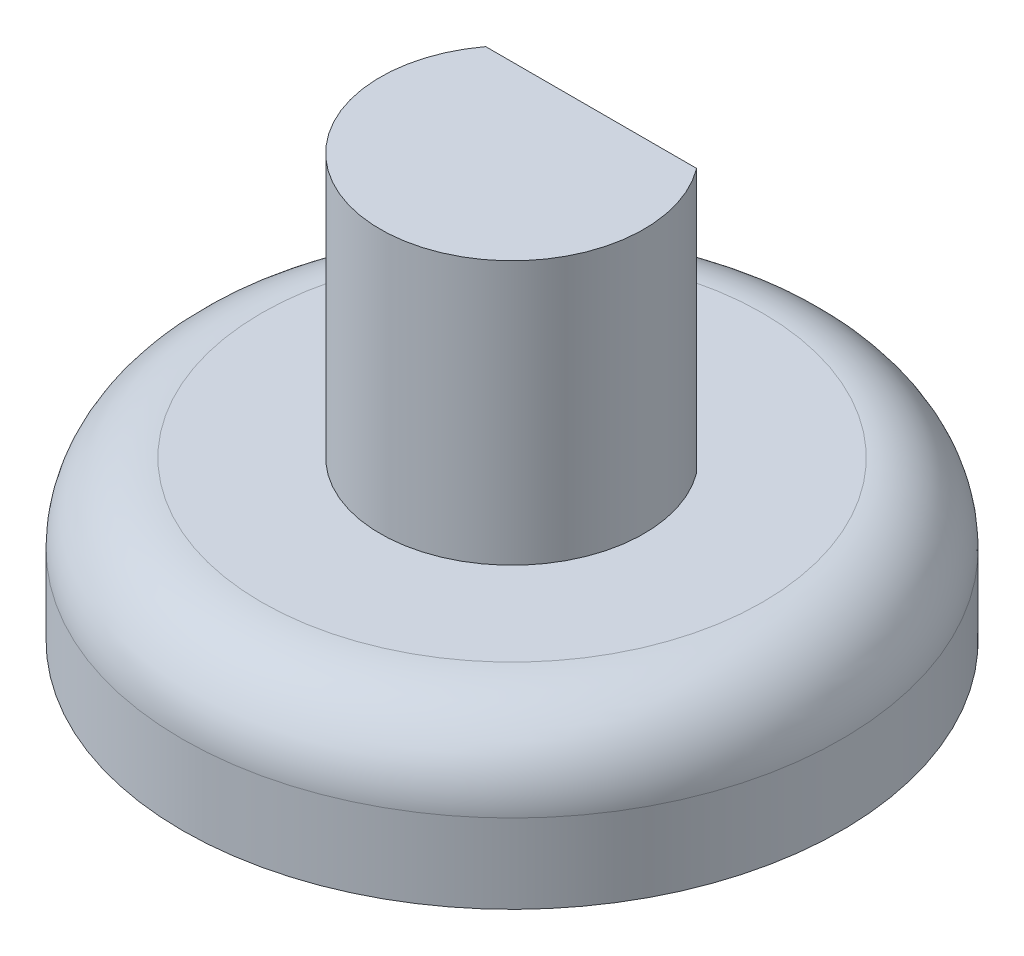
ISO-10303-21;
HEADER;
FILE_DESCRIPTION(('STEP AP214'),'2;1');
FILE_NAME('part.step','',(''),(''),'','','');
FILE_SCHEMA(('AUTOMOTIVE_DESIGN { 1 0 10303 214 1 1 1 1 }'));
ENDSEC;
DATA;
#1=APPLICATION_CONTEXT('core data for automotive mechanical design processes');
#2=APPLICATION_PROTOCOL_DEFINITION('international standard','automotive_design',2000,#1);
#3=PRODUCT_CONTEXT('',#1,'mechanical');
#4=PRODUCT('Part','Part','',(#3));
#5=PRODUCT_RELATED_PRODUCT_CATEGORY('part','',(#4));
#6=PRODUCT_DEFINITION_FORMATION('','',#4);
#7=PRODUCT_DEFINITION_CONTEXT('part definition',#1,'design');
#8=PRODUCT_DEFINITION('design','',#6,#7);
#9=PRODUCT_DEFINITION_SHAPE('','',#8);
#10=(LENGTH_UNIT() NAMED_UNIT(*) SI_UNIT(.MILLI.,.METRE.));
#11=(NAMED_UNIT(*) PLANE_ANGLE_UNIT() SI_UNIT($,.RADIAN.));
#12=(NAMED_UNIT(*) SI_UNIT($,.STERADIAN.) SOLID_ANGLE_UNIT());
#13=UNCERTAINTY_MEASURE_WITH_UNIT(LENGTH_MEASURE(1.E-05),#10,'distance_accuracy_value','');
#14=(GEOMETRIC_REPRESENTATION_CONTEXT(3) GLOBAL_UNCERTAINTY_ASSIGNED_CONTEXT((#13)) GLOBAL_UNIT_ASSIGNED_CONTEXT((#10,
#11,#12)) REPRESENTATION_CONTEXT('',''));
#15=CARTESIAN_POINT('',(0.,0.,0.));
#16=DIRECTION('',(0.,0.,1.));
#17=DIRECTION('',(1.,0.,0.));
#18=AXIS2_PLACEMENT_3D('',#15,#16,#17);
#19=CARTESIAN_POINT('',(0.,3.,0.));
#20=DIRECTION('',(0.,-1.,0.));
#21=DIRECTION('',(0.,0.,-1.));
#22=AXIS2_PLACEMENT_3D('',#19,#20,#21);
#23=CYLINDRICAL_SURFACE('',#22,6.25);
#24=CARTESIAN_POINT('',(0.,1.5,0.));
#25=DIRECTION('',(0.,1.,0.));
#26=DIRECTION('',(0.,0.,1.));
#27=AXIS2_PLACEMENT_3D('',#24,#25,#26);
#28=CIRCLE('',#27,6.25);
#29=CARTESIAN_POINT('',(0.,1.5,6.25));
#30=VERTEX_POINT('',#29);
#31=EDGE_CURVE('E11',#30,#30,#28,.F.);
#32=ORIENTED_EDGE('',*,*,#31,.T.);
#33=EDGE_LOOP('',(#32));
#34=FACE_BOUND('',#33,.T.);
#35=CARTESIAN_POINT('',(0.,0.,0.));
#36=DIRECTION('',(0.,1.,0.));
#37=DIRECTION('',(0.,0.,1.));
#38=AXIS2_PLACEMENT_3D('',#35,#36,#37);
#39=CIRCLE('',#38,6.25);
#40=CARTESIAN_POINT('',(0.,0.,6.25));
#41=VERTEX_POINT('',#40);
#42=EDGE_CURVE('E89',#41,#41,#39,.T.);
#43=ORIENTED_EDGE('',*,*,#42,.T.);
#44=EDGE_LOOP('',(#43));
#45=FACE_BOUND('',#44,.T.);
#46=ADVANCED_FACE('F41',(#34,#45),#23,.T.);
#47=CARTESIAN_POINT('',(0.,3.,0.));
#48=DIRECTION('',(0.,1.,0.));
#49=DIRECTION('',(0.,0.,1.));
#50=AXIS2_PLACEMENT_3D('',#47,#48,#49);
#51=PLANE('',#50);
#52=CARTESIAN_POINT('',(0.,3.,0.));
#53=DIRECTION('',(0.,1.,0.));
#54=DIRECTION('',(0.,0.,1.));
#55=AXIS2_PLACEMENT_3D('',#52,#53,#54);
#56=CIRCLE('',#55,4.75);
#57=CARTESIAN_POINT('',(0.,3.,4.75));
#58=VERTEX_POINT('',#57);
#59=EDGE_CURVE('E50',#58,#58,#56,.T.);
#60=ORIENTED_EDGE('',*,*,#59,.T.);
#61=EDGE_LOOP('',(#60));
#62=FACE_BOUND('',#61,.T.);
#63=CARTESIAN_POINT('',(0.,3.,0.));
#64=DIRECTION('',(0.,1.,0.));
#65=DIRECTION('',(0.,0.,1.));
#66=AXIS2_PLACEMENT_3D('',#63,#64,#65);
#67=CIRCLE('',#66,2.5);
#68=CARTESIAN_POINT('',(-2.,3.,-1.5));
#69=VERTEX_POINT('',#68);
#70=CARTESIAN_POINT('',(2.,3.,-1.5));
#71=VERTEX_POINT('',#70);
#72=EDGE_CURVE('E69',#69,#71,#67,.T.);
#73=ORIENTED_EDGE('',*,*,#72,.F.);
#74=DIRECTION('',(-1.,0.,0.));
#75=VECTOR('',#74,1.);
#76=CARTESIAN_POINT('',(-2.,3.,-1.5));
#77=LINE('',#76,#75);
#78=EDGE_CURVE('E56',#71,#69,#77,.T.);
#79=ORIENTED_EDGE('',*,*,#78,.F.);
#80=EDGE_LOOP('',(#73,#79));
#81=FACE_BOUND('',#80,.T.);
#82=ADVANCED_FACE('F70',(#62,#81),#51,.T.);
#83=CARTESIAN_POINT('',(0.,0.,0.));
#84=DIRECTION('',(0.,1.,0.));
#85=DIRECTION('',(0.,0.,1.));
#86=AXIS2_PLACEMENT_3D('',#83,#84,#85);
#87=PLANE('',#86);
#88=ORIENTED_EDGE('',*,*,#42,.F.);
#89=EDGE_LOOP('',(#88));
#90=FACE_BOUND('',#89,.T.);
#91=ADVANCED_FACE('F113',(#90),#87,.F.);
#92=CARTESIAN_POINT('',(0.,8.,0.));
#93=DIRECTION('',(0.,-1.,0.));
#94=DIRECTION('',(0.,0.,-1.));
#95=AXIS2_PLACEMENT_3D('',#92,#93,#94);
#96=CYLINDRICAL_SURFACE('',#95,2.5);
#97=ORIENTED_EDGE('',*,*,#72,.T.);
#98=DIRECTION('',(0.,-1.,0.));
#99=VECTOR('',#98,1.);
#100=CARTESIAN_POINT('',(2.,8.,-1.5));
#101=LINE('',#100,#99);
#102=CARTESIAN_POINT('',(2.,8.,-1.5));
#103=VERTEX_POINT('',#102);
#104=EDGE_CURVE('E80',#103,#71,#101,.T.);
#105=ORIENTED_EDGE('',*,*,#104,.F.);
#106=CARTESIAN_POINT('',(0.,8.,0.));
#107=DIRECTION('',(0.,1.,0.));
#108=DIRECTION('',(0.,0.,1.));
#109=AXIS2_PLACEMENT_3D('',#106,#107,#108);
#110=CIRCLE('',#109,2.5);
#111=CARTESIAN_POINT('',(-2.,8.,-1.5));
#112=VERTEX_POINT('',#111);
#113=EDGE_CURVE('E82',#112,#103,#110,.T.);
#114=ORIENTED_EDGE('',*,*,#113,.F.);
#115=DIRECTION('',(0.,-1.,0.));
#116=VECTOR('',#115,1.);
#117=CARTESIAN_POINT('',(-2.,8.,-1.5));
#118=LINE('',#117,#116);
#119=EDGE_CURVE('E78',#112,#69,#118,.T.);
#120=ORIENTED_EDGE('',*,*,#119,.T.);
#121=EDGE_LOOP('',(#97,#105,#114,#120));
#122=FACE_BOUND('',#121,.T.);
#123=ADVANCED_FACE('F84',(#122),#96,.T.);
#124=CARTESIAN_POINT('',(-2.,8.,-1.5));
#125=DIRECTION('',(0.,0.,1.));
#126=DIRECTION('',(1.,0.,0.));
#127=AXIS2_PLACEMENT_3D('',#124,#125,#126);
#128=PLANE('',#127);
#129=ORIENTED_EDGE('',*,*,#78,.T.);
#130=ORIENTED_EDGE('',*,*,#119,.F.);
#131=DIRECTION('',(-1.,0.,0.));
#132=VECTOR('',#131,1.);
#133=CARTESIAN_POINT('',(-2.,8.,-1.5));
#134=LINE('',#133,#132);
#135=EDGE_CURVE('E64',#103,#112,#134,.T.);
#136=ORIENTED_EDGE('',*,*,#135,.F.);
#137=ORIENTED_EDGE('',*,*,#104,.T.);
#138=EDGE_LOOP('',(#129,#130,#136,#137));
#139=FACE_BOUND('',#138,.T.);
#140=ADVANCED_FACE('F77',(#139),#128,.F.);
#141=CARTESIAN_POINT('',(0.,8.,0.));
#142=DIRECTION('',(0.,1.,0.));
#143=DIRECTION('',(0.,0.,1.));
#144=AXIS2_PLACEMENT_3D('',#141,#142,#143);
#145=PLANE('',#144);
#146=ORIENTED_EDGE('',*,*,#113,.T.);
#147=ORIENTED_EDGE('',*,*,#135,.T.);
#148=EDGE_LOOP('',(#146,#147));
#149=FACE_BOUND('',#148,.T.);
#150=ADVANCED_FACE('F101',(#149),#145,.T.);
#151=CARTESIAN_POINT('',(0.,1.5,0.));
#152=DIRECTION('',(0.,1.,0.));
#153=DIRECTION('',(0.,0.,1.));
#154=AXIS2_PLACEMENT_3D('',#151,#152,#153);
#155=TOROIDAL_SURFACE('',#154,4.75,1.5);
#156=ORIENTED_EDGE('',*,*,#31,.F.);
#157=EDGE_LOOP('',(#156));
#158=FACE_BOUND('',#157,.T.);
#159=ORIENTED_EDGE('',*,*,#59,.F.);
#160=EDGE_LOOP('',(#159));
#161=FACE_BOUND('',#160,.T.);
#162=ADVANCED_FACE('F43',(#158,#161),#155,.T.);
#163=CLOSED_SHELL('',(#46,#82,#91,#123,#140,#150,#162));
#164=MANIFOLD_SOLID_BREP('B2',#163);
#165=ADVANCED_BREP_SHAPE_REPRESENTATION('',(#18,#164),#14);
#166=SHAPE_DEFINITION_REPRESENTATION(#9,#165);
ENDSEC;
END-ISO-10303-21;
